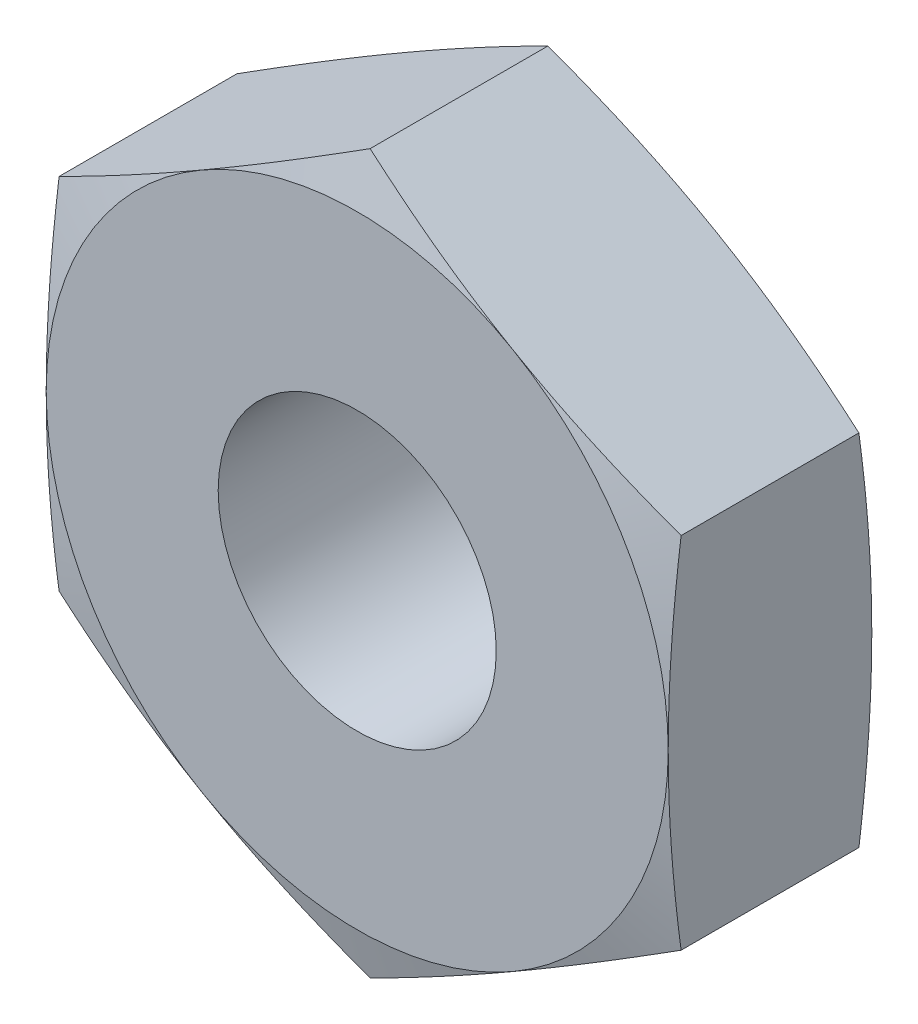
ISO-10303-21;
HEADER;
FILE_DESCRIPTION(('STEP AP214'),'2;1');
FILE_NAME('part.step','',(''),(''),'','','');
FILE_SCHEMA(('AUTOMOTIVE_DESIGN { 1 0 10303 214 1 1 1 1 }'));
ENDSEC;
DATA;
#1=APPLICATION_CONTEXT('core data for automotive mechanical design processes');
#2=APPLICATION_PROTOCOL_DEFINITION('international standard','automotive_design',2000,#1);
#3=PRODUCT_CONTEXT('',#1,'mechanical');
#4=PRODUCT('Part','Part','',(#3));
#5=PRODUCT_RELATED_PRODUCT_CATEGORY('part','',(#4));
#6=PRODUCT_DEFINITION_FORMATION('','',#4);
#7=PRODUCT_DEFINITION_CONTEXT('part definition',#1,'design');
#8=PRODUCT_DEFINITION('design','',#6,#7);
#9=PRODUCT_DEFINITION_SHAPE('','',#8);
#10=(LENGTH_UNIT() NAMED_UNIT(*) SI_UNIT(.MILLI.,.METRE.));
#11=(NAMED_UNIT(*) PLANE_ANGLE_UNIT() SI_UNIT($,.RADIAN.));
#12=(NAMED_UNIT(*) SI_UNIT($,.STERADIAN.) SOLID_ANGLE_UNIT());
#13=UNCERTAINTY_MEASURE_WITH_UNIT(LENGTH_MEASURE(1.E-05),#10,'distance_accuracy_value','');
#14=(GEOMETRIC_REPRESENTATION_CONTEXT(3) GLOBAL_UNCERTAINTY_ASSIGNED_CONTEXT((#13)) GLOBAL_UNIT_ASSIGNED_CONTEXT((#10,
#11,#12)) REPRESENTATION_CONTEXT('',''));
#15=CARTESIAN_POINT('',(0.,0.,0.));
#16=DIRECTION('',(0.,0.,1.));
#17=DIRECTION('',(1.,0.,0.));
#18=AXIS2_PLACEMENT_3D('',#15,#16,#17);
#19=CARTESIAN_POINT('',(2.75,1.58771324027147,1.8));
#20=DIRECTION('',(-0.5,-0.866025403784439,0.));
#21=DIRECTION('',(0.866025403784439,-0.5,0.));
#22=AXIS2_PLACEMENT_3D('',#19,#20,#21);
#23=PLANE('',#22);
#24=CARTESIAN_POINT('',(2.7502,1.58759777021763,1.68597637630445));
#25=CARTESIAN_POINT('',(2.63598285454709,1.65354106989094,1.70365443906504));
#26=CARTESIAN_POINT('',(2.52155860080835,1.71960394358883,1.71970328837943));
#27=CARTESIAN_POINT('',(2.29230593851367,1.8519630298771,1.74789971485019));
#28=CARTESIAN_POINT('',(2.17747738484796,1.91825932624665,1.7600457069014));
#29=CARTESIAN_POINT('',(1.94811243055202,2.05068324435208,1.7797272517536));
#30=CARTESIAN_POINT('',(1.83357758136237,2.11680997036331,1.78728627891702));
#31=CARTESIAN_POINT('',(1.60436179973292,2.24914776358959,1.79742217092489));
#32=CARTESIAN_POINT('',(1.48968089986646,2.3153588119984,1.8));
#33=CARTESIAN_POINT('',(1.26031910013354,2.44778090881602,1.8));
#34=CARTESIAN_POINT('',(1.14563820026708,2.51399195722482,1.79742217092489));
#35=CARTESIAN_POINT('',(0.91642241863763,2.6463297504511,1.78728627891702));
#36=CARTESIAN_POINT('',(0.801887569447985,2.71245647646233,1.7797272517536));
#37=CARTESIAN_POINT('',(0.572522615152036,2.84488039456776,1.7600457069014));
#38=CARTESIAN_POINT('',(0.457694061486332,2.91117669093731,1.74789971485019));
#39=CARTESIAN_POINT('',(0.228441399191655,3.04353577722558,1.71970328837943));
#40=CARTESIAN_POINT('',(0.114017145452912,3.10959865092347,1.70365443906504));
#41=CARTESIAN_POINT('',(-0.000199999999999591,3.17554195059678,1.68597637630445));
#42=B_SPLINE_CURVE_WITH_KNOTS('',3,(#24,#25,#26,#27,#28,#29,#30,#31,#32,#33,#34,#35,#36,#37,#38,
#39,#40,#41),.UNSPECIFIED.,.F.,.F.,(4,2,2,2,2,2,2,2,4),(0.,0.399219246203695,0.798600426844826,
1.19592009799431,1.59316285066086,1.99040560332741,2.38772527447689,2.78710645511802,
3.18632570132172),.UNSPECIFIED.);
#43=CARTESIAN_POINT('',(2.75,1.58771324027147,1.68600731809971));
#44=VERTEX_POINT('',#43);
#45=CARTESIAN_POINT('',(1.375,2.38156986040721,1.8));
#46=VERTEX_POINT('',#45);
#47=EDGE_CURVE('E130',#44,#46,#42,.T.);
#48=ORIENTED_EDGE('',*,*,#47,.F.);
#49=DIRECTION('',(0.,0.,-1.));
#50=VECTOR('',#49,1.);
#51=CARTESIAN_POINT('',(2.75,1.58771324027147,1.8));
#52=LINE('',#51,#50);
#53=CARTESIAN_POINT('',(2.75,1.58771324027147,0.113992681900295));
#54=VERTEX_POINT('',#53);
#55=EDGE_CURVE('E238',#44,#54,#52,.T.);
#56=ORIENTED_EDGE('',*,*,#55,.T.);
#57=CARTESIAN_POINT('',(-0.000200000000000002,3.17554195059678,0.114023623695551));
#58=CARTESIAN_POINT('',(0.114017145452911,3.10959865092347,0.0963455609349599));
#59=CARTESIAN_POINT('',(0.228441399191655,3.04353577722558,0.0802967116205655));
#60=CARTESIAN_POINT('',(0.457694061486332,2.91117669093731,0.0521002851498102));
#61=CARTESIAN_POINT('',(0.572522615152035,2.84488039456776,0.0399542930985983));
#62=CARTESIAN_POINT('',(0.801887569447984,2.71245647646233,0.0202727482464014));
#63=CARTESIAN_POINT('',(0.91642241863763,2.6463297504511,0.012713721082982));
#64=CARTESIAN_POINT('',(1.14563820026708,2.51399195722482,0.00257782907510846));
#65=CARTESIAN_POINT('',(1.26031910013354,2.44778090881602,0.));
#66=CARTESIAN_POINT('',(1.48968089986646,2.3153588119984,0.));
#67=CARTESIAN_POINT('',(1.60436179973292,2.24914776358959,0.00257782907510843));
#68=CARTESIAN_POINT('',(1.83357758136237,2.11680997036331,0.012713721082982));
#69=CARTESIAN_POINT('',(1.94811243055201,2.05068324435208,0.0202727482464014));
#70=CARTESIAN_POINT('',(2.17747738484796,1.91825932624665,0.0399542930985985));
#71=CARTESIAN_POINT('',(2.29230593851367,1.8519630298771,0.0521002851498105));
#72=CARTESIAN_POINT('',(2.52155860080835,1.71960394358883,0.0802967116205658));
#73=CARTESIAN_POINT('',(2.63598285454709,1.65354106989094,0.0963455609349602));
#74=CARTESIAN_POINT('',(2.7502,1.58759777021763,0.114023623695551));
#75=B_SPLINE_CURVE_WITH_KNOTS('',3,(#57,#58,#59,#60,#61,#62,#63,#64,#65,#66,#67,#68,#69,#70,#71,
#72,#73,#74),.UNSPECIFIED.,.F.,.F.,(4,2,2,2,2,2,2,2,4),(0.,0.399219246203695,0.798600426844827,
1.19592009799431,1.59316285066086,1.99040560332741,2.38772527447689,2.78710645511802,
3.18632570132172),.UNSPECIFIED.);
#76=CARTESIAN_POINT('',(1.375,2.38156986040721,0.));
#77=VERTEX_POINT('',#76);
#78=EDGE_CURVE('E278',#77,#54,#75,.T.);
#79=ORIENTED_EDGE('',*,*,#78,.F.);
#80=CARTESIAN_POINT('',(0.,3.17542648054294,0.113992681900294));
#81=VERTEX_POINT('',#80);
#82=EDGE_CURVE('E284',#81,#77,#75,.T.);
#83=ORIENTED_EDGE('',*,*,#82,.F.);
#84=DIRECTION('',(0.,0.,-1.));
#85=VECTOR('',#84,1.);
#86=CARTESIAN_POINT('',(0.,3.17542648054294,1.8));
#87=LINE('',#86,#85);
#88=CARTESIAN_POINT('',(0.,3.17542648054294,1.68600731809971));
#89=VERTEX_POINT('',#88);
#90=EDGE_CURVE('E153',#89,#81,#87,.T.);
#91=ORIENTED_EDGE('',*,*,#90,.F.);
#92=EDGE_CURVE('E140',#46,#89,#42,.T.);
#93=ORIENTED_EDGE('',*,*,#92,.F.);
#94=EDGE_LOOP('',(#48,#56,#79,#83,#91,#93));
#95=FACE_BOUND('',#94,.T.);
#96=ADVANCED_FACE('F38',(#95),#23,.F.);
#97=CARTESIAN_POINT('',(0.,3.17542648054294,1.8));
#98=DIRECTION('',(0.5,-0.866025403784439,0.));
#99=DIRECTION('',(0.866025403784439,0.5,0.));
#100=AXIS2_PLACEMENT_3D('',#97,#98,#99);
#101=PLANE('',#100);
#102=CARTESIAN_POINT('',(0.000200000000000058,3.17554195059678,1.68597637630445));
#103=CARTESIAN_POINT('',(-0.114017145452912,3.10959865092347,1.70365443906504));
#104=CARTESIAN_POINT('',(-0.228441399191655,3.04353577722558,1.71970328837943));
#105=CARTESIAN_POINT('',(-0.457694061486332,2.91117669093731,1.74789971485019));
#106=CARTESIAN_POINT('',(-0.572522615152036,2.84488039456776,1.7600457069014));
#107=CARTESIAN_POINT('',(-0.801887569447985,2.71245647646233,1.7797272517536));
#108=CARTESIAN_POINT('',(-0.916422418637631,2.6463297504511,1.78728627891702));
#109=CARTESIAN_POINT('',(-1.14563820026708,2.51399195722482,1.79742217092489));
#110=CARTESIAN_POINT('',(-1.26031910013354,2.44778090881602,1.8));
#111=CARTESIAN_POINT('',(-1.48968089986646,2.3153588119984,1.8));
#112=CARTESIAN_POINT('',(-1.60436179973292,2.24914776358959,1.79742217092489));
#113=CARTESIAN_POINT('',(-1.83357758136237,2.11680997036331,1.78728627891702));
#114=CARTESIAN_POINT('',(-1.94811243055202,2.05068324435208,1.7797272517536));
#115=CARTESIAN_POINT('',(-2.17747738484796,1.91825932624665,1.7600457069014));
#116=CARTESIAN_POINT('',(-2.29230593851367,1.8519630298771,1.74789971485019));
#117=CARTESIAN_POINT('',(-2.52155860080835,1.71960394358883,1.71970328837943));
#118=CARTESIAN_POINT('',(-2.63598285454709,1.65354106989094,1.70365443906504));
#119=CARTESIAN_POINT('',(-2.7502,1.58759777021763,1.68597637630445));
#120=B_SPLINE_CURVE_WITH_KNOTS('',3,(#102,#103,#104,#105,#106,#107,#108,#109,#110,#111,#112,
#113,#114,#115,#116,#117,#118,#119),.UNSPECIFIED.,.F.,.F.,(4,2,2,2,2,2,2,2,4),(0.,
0.399219246203696,0.798600426844827,1.19592009799431,1.59316285066086,1.99040560332741,
2.38772527447689,2.78710645511802,3.18632570132172),.UNSPECIFIED.);
#121=CARTESIAN_POINT('',(-1.375,2.38156986040721,1.8));
#122=VERTEX_POINT('',#121);
#123=EDGE_CURVE('E145',#89,#122,#120,.T.);
#124=ORIENTED_EDGE('',*,*,#123,.F.);
#125=ORIENTED_EDGE('',*,*,#90,.T.);
#126=CARTESIAN_POINT('',(-2.7502,1.58759777021763,0.114023623695551));
#127=CARTESIAN_POINT('',(-2.63598285454709,1.65354106989094,0.0963455609349604));
#128=CARTESIAN_POINT('',(-2.52155860080835,1.71960394358883,0.0802967116205659));
#129=CARTESIAN_POINT('',(-2.29230593851367,1.8519630298771,0.0521002851498105));
#130=CARTESIAN_POINT('',(-2.17747738484796,1.91825932624665,0.0399542930985984));
#131=CARTESIAN_POINT('',(-1.94811243055202,2.05068324435208,0.0202727482464014));
#132=CARTESIAN_POINT('',(-1.83357758136237,2.11680997036331,0.0127137210829821));
#133=CARTESIAN_POINT('',(-1.60436179973292,2.24914776358959,0.00257782907510853));
#134=CARTESIAN_POINT('',(-1.48968089986646,2.3153588119984,0.));
#135=CARTESIAN_POINT('',(-1.26031910013354,2.44778090881602,0.));
#136=CARTESIAN_POINT('',(-1.14563820026708,2.51399195722482,0.00257782907510842));
#137=CARTESIAN_POINT('',(-0.916422418637631,2.6463297504511,0.0127137210829819));
#138=CARTESIAN_POINT('',(-0.801887569447985,2.71245647646233,0.0202727482464013));
#139=CARTESIAN_POINT('',(-0.572522615152036,2.84488039456776,0.0399542930985984));
#140=CARTESIAN_POINT('',(-0.457694061486332,2.91117669093731,0.0521002851498103));
#141=CARTESIAN_POINT('',(-0.228441399191655,3.04353577722558,0.0802967116205656));
#142=CARTESIAN_POINT('',(-0.114017145452912,3.10959865092347,0.09634556093496));
#143=CARTESIAN_POINT('',(0.00020000000000006,3.17554195059678,0.114023623695551));
#144=B_SPLINE_CURVE_WITH_KNOTS('',3,(#126,#127,#128,#129,#130,#131,#132,#133,#134,#135,#136,
#137,#138,#139,#140,#141,#142,#143),.UNSPECIFIED.,.F.,.F.,(4,2,2,2,2,2,2,2,4),(0.,
0.399219246203695,0.798600426844827,1.19592009799431,1.59316285066086,1.99040560332741,
2.38772527447689,2.78710645511802,3.18632570132172),.UNSPECIFIED.);
#145=CARTESIAN_POINT('',(-1.375,2.38156986040721,0.));
#146=VERTEX_POINT('',#145);
#147=EDGE_CURVE('E229',#146,#81,#144,.T.);
#148=ORIENTED_EDGE('',*,*,#147,.F.);
#149=CARTESIAN_POINT('',(-2.75,1.58771324027147,0.113992681900295));
#150=VERTEX_POINT('',#149);
#151=EDGE_CURVE('E297',#150,#146,#144,.T.);
#152=ORIENTED_EDGE('',*,*,#151,.F.);
#153=DIRECTION('',(0.,0.,-1.));
#154=VECTOR('',#153,1.);
#155=CARTESIAN_POINT('',(-2.75,1.58771324027147,1.8));
#156=LINE('',#155,#154);
#157=CARTESIAN_POINT('',(-2.75,1.58771324027147,1.68600731809971));
#158=VERTEX_POINT('',#157);
#159=EDGE_CURVE('E249',#158,#150,#156,.T.);
#160=ORIENTED_EDGE('',*,*,#159,.F.);
#161=EDGE_CURVE('E154',#122,#158,#120,.T.);
#162=ORIENTED_EDGE('',*,*,#161,.F.);
#163=EDGE_LOOP('',(#124,#125,#148,#152,#160,#162));
#164=FACE_BOUND('',#163,.T.);
#165=ADVANCED_FACE('F213',(#164),#101,.F.);
#166=CARTESIAN_POINT('',(-2.75,1.58771324027147,1.8));
#167=DIRECTION('',(1.,0.,0.));
#168=DIRECTION('',(0.,1.,0.));
#169=AXIS2_PLACEMENT_3D('',#166,#167,#168);
#170=PLANE('',#169);
#171=CARTESIAN_POINT('',(-2.75,-4.25453687273644,1.17945008662811));
#172=CARTESIAN_POINT('',(-2.75,-4.12909089129006,1.20767247329542));
#173=CARTESIAN_POINT('',(-2.75,-4.00356795369818,1.23555805706843));
#174=CARTESIAN_POINT('',(-2.75,-3.75233011444115,1.29047493653844));
#175=CARTESIAN_POINT('',(-2.75,-3.626615205051,1.31750619685393));
#176=CARTESIAN_POINT('',(-2.75,-3.37485312154851,1.370555112766));
#177=CARTESIAN_POINT('',(-2.75,-3.24880575075381,1.39657183947184));
#178=CARTESIAN_POINT('',(-2.75,-2.99645280115617,1.44731465391408));
#179=CARTESIAN_POINT('',(-2.75,-2.87014722444224,1.47204075204958));
#180=CARTESIAN_POINT('',(-2.75,-2.49300467644484,1.54342857241483));
#181=CARTESIAN_POINT('',(-2.75,-2.24172159436404,1.58777757678498));
#182=CARTESIAN_POINT('',(-2.75,-1.7376157375192,1.66694239256266));
#183=CARTESIAN_POINT('',(-2.75,-1.48479314049277,1.70175928389781));
#184=CARTESIAN_POINT('',(-2.75,-1.10290958741393,1.74356563703142));
#185=CARTESIAN_POINT('',(-2.75,-0.974426083027352,1.7558043409763));
#186=CARTESIAN_POINT('',(-2.75,-0.717131491270936,1.77607018305311));
#187=CARTESIAN_POINT('',(-2.75,-0.588320433054099,1.78409768365752));
#188=CARTESIAN_POINT('',(-2.75,-0.330552993362774,1.79547685370073));
#189=CARTESIAN_POINT('',(-2.75,-0.201596717702777,1.7988308751996));
#190=CARTESIAN_POINT('',(-2.75,0.0563509023935529,1.80065532808311));
#191=CARTESIAN_POINT('',(-2.75,0.185342246751155,1.79912577034246));
#192=CARTESIAN_POINT('',(-2.75,0.443745656700354,1.79126544452901));
#193=CARTESIAN_POINT('',(-2.75,0.573157064948089,1.78491350559601));
#194=CARTESIAN_POINT('',(-2.75,0.831686842018706,1.76777141461889));
#195=CARTESIAN_POINT('',(-2.75,0.96080519485833,1.75698102608503));
#196=CARTESIAN_POINT('',(-2.75,1.21874620164664,1.73152067195787));
#197=CARTESIAN_POINT('',(-2.75,1.34756857747991,1.71684793249756));
#198=CARTESIAN_POINT('',(-2.75,1.60479542826123,1.68425029283339));
#199=CARTESIAN_POINT('',(-2.75,1.7331999043507,1.66632540151996));
#200=CARTESIAN_POINT('',(-2.75,2.01078933211007,1.62463385061709));
#201=CARTESIAN_POINT('',(-2.75,2.15990224778535,1.60039132237994));
#202=CARTESIAN_POINT('',(-2.75,2.45764548681983,1.5490930629821));
#203=CARTESIAN_POINT('',(-2.75,2.60627578642122,1.52203719543054));
#204=CARTESIAN_POINT('',(-2.75,2.90314719325471,1.46574163878066));
#205=CARTESIAN_POINT('',(-2.75,3.05138822629453,1.43650156080234));
#206=CARTESIAN_POINT('',(-2.75,3.34752619803917,1.37632306581721));
#207=CARTESIAN_POINT('',(-2.75,3.49542313032354,1.34538461738191));
#208=CARTESIAN_POINT('',(-2.75,3.93882414451981,1.2505685954105));
#209=CARTESIAN_POINT('',(-2.75,4.23390501652389,1.18471640243034));
#210=CARTESIAN_POINT('',(-2.75,4.82331106256456,1.0497140323235));
#211=CARTESIAN_POINT('',(-2.75,5.11763621517978,0.980563762774737));
#212=CARTESIAN_POINT('',(-2.75,5.7015455399541,0.841080402530205));
#213=CARTESIAN_POINT('',(-2.75,5.99113717763739,0.770778490171721));
#214=CARTESIAN_POINT('',(-2.75,6.56996820229718,0.628701349925971));
#215=CARTESIAN_POINT('',(-2.75,6.85920757686581,0.556926071646078));
#216=CARTESIAN_POINT('',(-2.75,7.43690019898123,0.412457441864233));
#217=CARTESIAN_POINT('',(-2.75,7.72535392177245,0.339765987526337));
#218=CARTESIAN_POINT('',(-2.75,8.3020483493631,0.193598211670681));
#219=CARTESIAN_POINT('',(-2.75,8.59028906340869,0.120121926655646));
#220=CARTESIAN_POINT('',(-2.75,8.87846102559692,0.0463799887537183));
#221=B_SPLINE_CURVE_WITH_KNOTS('',3,(#171,#172,#173,#174,#175,#176,#177,#178,#179,#180,#181,
#182,#183,#184,#185,#186,#187,#188,#189,#190,#191,#192,#193,#194,#195,#196,#197,#198,#199,#200,
#201,#202,#203,#204,#205,#206,#207,#208,#209,#210,#211,#212,#213,#214,#215,#216,#217,#218,#219,
#220),.UNSPECIFIED.,.F.,.F.,(4,2,2,2,2,2,2,2,2,2,2,2,2,2,2,2,2,2,2,2,2,2,2,2,4),(0.,
0.385745633364974,0.771507221376578,1.15761408845767,1.54371784404495,2.30911364653726,
3.07442269864926,3.46156048964449,3.84866495291471,4.23557452450059,4.6224832345202,
5.01110041568801,5.39973830586289,5.7886546238612,6.17756987869289,6.63074612953532,
7.08394436064651,7.53722347303431,7.99051097621848,8.89749375633669,9.80450196780339,
10.6985045624971,11.5925377853268,12.4849525738477,13.3773260350548),.UNSPECIFIED.);
#222=CARTESIAN_POINT('',(-2.75,0.,1.8));
#223=VERTEX_POINT('',#222);
#224=EDGE_CURVE('E207',#158,#223,#221,.F.);
#225=ORIENTED_EDGE('',*,*,#224,.F.);
#226=ORIENTED_EDGE('',*,*,#159,.T.);
#227=CARTESIAN_POINT('',(-2.75,-4.25453687273644,0.62054991337189));
#228=CARTESIAN_POINT('',(-2.75,-4.12909089129006,0.592327526704578));
#229=CARTESIAN_POINT('',(-2.75,-4.00356795369818,0.564441942931572));
#230=CARTESIAN_POINT('',(-2.75,-3.75233011444115,0.509525063461557));
#231=CARTESIAN_POINT('',(-2.75,-3.626615205051,0.482493803146066));
#232=CARTESIAN_POINT('',(-2.75,-3.37485312154851,0.429444887233998));
#233=CARTESIAN_POINT('',(-2.75,-3.24880575075381,0.403428160528158));
#234=CARTESIAN_POINT('',(-2.75,-2.99645280115617,0.352685346085919));
#235=CARTESIAN_POINT('',(-2.75,-2.87014722444224,0.327959247950424));
#236=CARTESIAN_POINT('',(-2.75,-2.49300467644484,0.25657142758517));
#237=CARTESIAN_POINT('',(-2.75,-2.24172159436404,0.212222423215025));
#238=CARTESIAN_POINT('',(-2.75,-1.7376157375192,0.133057607437342));
#239=CARTESIAN_POINT('',(-2.75,-1.48479314049277,0.098240716102193));
#240=CARTESIAN_POINT('',(-2.75,-1.10290958741393,0.0564343629685761));
#241=CARTESIAN_POINT('',(-2.75,-0.974426083027352,0.0441956590237022));
#242=CARTESIAN_POINT('',(-2.75,-0.717131491270936,0.0239298169468935));
#243=CARTESIAN_POINT('',(-2.75,-0.588320433054099,0.0159023163424837));
#244=CARTESIAN_POINT('',(-2.75,-0.330552993362774,0.00452314629927444));
#245=CARTESIAN_POINT('',(-2.75,-0.201596717702777,0.00116912480040349));
#246=CARTESIAN_POINT('',(-2.75,0.0563509023935528,-0.000655328083106099));
#247=CARTESIAN_POINT('',(-2.75,0.185342246751155,0.000874229657543568));
#248=CARTESIAN_POINT('',(-2.75,0.443745656700355,0.00873455547099419));
#249=CARTESIAN_POINT('',(-2.75,0.573157064948089,0.0150864944039938));
#250=CARTESIAN_POINT('',(-2.75,0.831686842018706,0.0322285853811115));
#251=CARTESIAN_POINT('',(-2.75,0.96080519485833,0.0430189739149718));
#252=CARTESIAN_POINT('',(-2.75,1.21874620164664,0.0684793280421257));
#253=CARTESIAN_POINT('',(-2.75,1.34756857747991,0.0831520675024364));
#254=CARTESIAN_POINT('',(-2.75,1.60479542826123,0.115749707166606));
#255=CARTESIAN_POINT('',(-2.75,1.7331999043507,0.133674598480039));
#256=CARTESIAN_POINT('',(-2.75,2.01078933211007,0.175366149382907));
#257=CARTESIAN_POINT('',(-2.75,2.15990224778535,0.199608677620064));
#258=CARTESIAN_POINT('',(-2.75,2.45764548681983,0.250906937017898));
#259=CARTESIAN_POINT('',(-2.75,2.60627578642122,0.277962804569464));
#260=CARTESIAN_POINT('',(-2.75,2.90314719325471,0.334258361219342));
#261=CARTESIAN_POINT('',(-2.75,3.05138822629453,0.36349843919766));
#262=CARTESIAN_POINT('',(-2.75,3.34752619803917,0.423676934182794));
#263=CARTESIAN_POINT('',(-2.75,3.49542313032354,0.454615382618093));
#264=CARTESIAN_POINT('',(-2.75,3.93882414451981,0.549431404589501));
#265=CARTESIAN_POINT('',(-2.75,4.23390501652388,0.615283597569656));
#266=CARTESIAN_POINT('',(-2.75,4.82331106256456,0.750285967676502));
#267=CARTESIAN_POINT('',(-2.75,5.11763621517977,0.819436237225262));
#268=CARTESIAN_POINT('',(-2.75,5.70154553995409,0.958919597469795));
#269=CARTESIAN_POINT('',(-2.75,5.99113717763739,1.02922150982828));
#270=CARTESIAN_POINT('',(-2.75,6.56996820229717,1.17129865007403));
#271=CARTESIAN_POINT('',(-2.75,6.85920757686581,1.24307392835392));
#272=CARTESIAN_POINT('',(-2.75,7.43690019898123,1.38754255813577));
#273=CARTESIAN_POINT('',(-2.75,7.72535392177245,1.46023401247366));
#274=CARTESIAN_POINT('',(-2.75,8.3020483493631,1.60640178832932));
#275=CARTESIAN_POINT('',(-2.75,8.59028906340868,1.67987807334435));
#276=CARTESIAN_POINT('',(-2.75,8.87846102559692,1.75362001124628));
#277=B_SPLINE_CURVE_WITH_KNOTS('',3,(#227,#228,#229,#230,#231,#232,#233,#234,#235,#236,#237,
#238,#239,#240,#241,#242,#243,#244,#245,#246,#247,#248,#249,#250,#251,#252,#253,#254,#255,#256,
#257,#258,#259,#260,#261,#262,#263,#264,#265,#266,#267,#268,#269,#270,#271,#272,#273,#274,#275,
#276),.UNSPECIFIED.,.F.,.F.,(4,2,2,2,2,2,2,2,2,2,2,2,2,2,2,2,2,2,2,2,2,2,2,2,4),(0.,
0.385745633364974,0.771507221376578,1.15761408845767,1.54371784404495,2.30911364653726,
3.07442269864926,3.46156048964449,3.84866495291471,4.23557452450059,4.6224832345202,
5.01110041568801,5.39973830586289,5.7886546238612,6.17756987869289,6.63074612953533,
7.08394436064651,7.53722347303431,7.99051097621848,8.89749375633669,9.80450196780339,
10.6985045624971,11.5925377853268,12.4849525738477,13.3773260350548),.UNSPECIFIED.);
#278=CARTESIAN_POINT('',(-2.75,0.,0.));
#279=VERTEX_POINT('',#278);
#280=EDGE_CURVE('E219',#279,#150,#277,.T.);
#281=ORIENTED_EDGE('',*,*,#280,.F.);
#282=CARTESIAN_POINT('',(-2.75,-1.58771324027147,0.113992681900295));
#283=VERTEX_POINT('',#282);
#284=EDGE_CURVE('E227',#283,#279,#277,.T.);
#285=ORIENTED_EDGE('',*,*,#284,.F.);
#286=DIRECTION('',(0.,0.,-1.));
#287=VECTOR('',#286,1.);
#288=CARTESIAN_POINT('',(-2.75,-1.58771324027147,1.8));
#289=LINE('',#288,#287);
#290=CARTESIAN_POINT('',(-2.75,-1.58771324027147,1.68600731809971));
#291=VERTEX_POINT('',#290);
#292=EDGE_CURVE('E247',#291,#283,#289,.T.);
#293=ORIENTED_EDGE('',*,*,#292,.F.);
#294=EDGE_CURVE('E201',#223,#291,#221,.F.);
#295=ORIENTED_EDGE('',*,*,#294,.F.);
#296=EDGE_LOOP('',(#225,#226,#281,#285,#293,#295));
#297=FACE_BOUND('',#296,.T.);
#298=ADVANCED_FACE('F209',(#297),#170,.F.);
#299=CARTESIAN_POINT('',(-2.75,-1.58771324027147,1.8));
#300=DIRECTION('',(0.5,0.866025403784439,0.));
#301=DIRECTION('',(-0.866025403784439,0.5,0.));
#302=AXIS2_PLACEMENT_3D('',#299,#300,#301);
#303=PLANE('',#302);
#304=CARTESIAN_POINT('',(-2.7502,-1.58759777021763,1.68597637630445));
#305=CARTESIAN_POINT('',(-2.63598285454709,-1.65354106989094,1.70365443906504));
#306=CARTESIAN_POINT('',(-2.52155860080835,-1.71960394358883,1.71970328837943));
#307=CARTESIAN_POINT('',(-2.29230593851367,-1.8519630298771,1.74789971485019));
#308=CARTESIAN_POINT('',(-2.17747738484796,-1.91825932624665,1.7600457069014));
#309=CARTESIAN_POINT('',(-1.94811243055202,-2.05068324435208,1.7797272517536));
#310=CARTESIAN_POINT('',(-1.83357758136237,-2.11680997036332,1.78728627891702));
#311=CARTESIAN_POINT('',(-1.60436179973292,-2.24914776358959,1.79742217092489));
#312=CARTESIAN_POINT('',(-1.48968089986646,-2.3153588119984,1.8));
#313=CARTESIAN_POINT('',(-1.26031910013354,-2.44778090881602,1.8));
#314=CARTESIAN_POINT('',(-1.14563820026708,-2.51399195722482,1.79742217092489));
#315=CARTESIAN_POINT('',(-0.91642241863763,-2.6463297504511,1.78728627891702));
#316=CARTESIAN_POINT('',(-0.801887569447984,-2.71245647646233,1.7797272517536));
#317=CARTESIAN_POINT('',(-0.572522615152035,-2.84488039456777,1.7600457069014));
#318=CARTESIAN_POINT('',(-0.457694061486332,-2.91117669093731,1.74789971485019));
#319=CARTESIAN_POINT('',(-0.228441399191654,-3.04353577722559,1.71970328837943));
#320=CARTESIAN_POINT('',(-0.114017145452911,-3.10959865092347,1.70365443906504));
#321=CARTESIAN_POINT('',(0.000200000000000669,-3.17554195059678,1.68597637630445));
#322=B_SPLINE_CURVE_WITH_KNOTS('',3,(#304,#305,#306,#307,#308,#309,#310,#311,#312,#313,#314,
#315,#316,#317,#318,#319,#320,#321),.UNSPECIFIED.,.F.,.F.,(4,2,2,2,2,2,2,2,4),(0.,
0.399219246203695,0.798600426844826,1.19592009799431,1.59316285066086,1.99040560332741,
2.38772527447689,2.78710645511802,3.18632570132172),.UNSPECIFIED.);
#323=CARTESIAN_POINT('',(-1.375,-2.38156986040721,1.8));
#324=VERTEX_POINT('',#323);
#325=EDGE_CURVE('E208',#291,#324,#322,.T.);
#326=ORIENTED_EDGE('',*,*,#325,.F.);
#327=ORIENTED_EDGE('',*,*,#292,.T.);
#328=CARTESIAN_POINT('',(0.000200000000000461,-3.17554195059678,0.114023623695551));
#329=CARTESIAN_POINT('',(-0.114017145452911,-3.10959865092347,0.0963455609349601));
#330=CARTESIAN_POINT('',(-0.228441399191654,-3.04353577722559,0.0802967116205657));
#331=CARTESIAN_POINT('',(-0.457694061486332,-2.91117669093731,0.0521002851498103));
#332=CARTESIAN_POINT('',(-0.572522615152035,-2.84488039456777,0.0399542930985984));
#333=CARTESIAN_POINT('',(-0.801887569447984,-2.71245647646233,0.0202727482464014));
#334=CARTESIAN_POINT('',(-0.91642241863763,-2.6463297504511,0.0127137210829821));
#335=CARTESIAN_POINT('',(-1.14563820026708,-2.51399195722482,0.00257782907510852));
#336=CARTESIAN_POINT('',(-1.26031910013354,-2.44778090881602,0.));
#337=CARTESIAN_POINT('',(-1.48968089986646,-2.3153588119984,0.));
#338=CARTESIAN_POINT('',(-1.60436179973292,-2.24914776358959,0.00257782907510852));
#339=CARTESIAN_POINT('',(-1.83357758136237,-2.11680997036332,0.0127137210829821));
#340=CARTESIAN_POINT('',(-1.94811243055202,-2.05068324435208,0.0202727482464014));
#341=CARTESIAN_POINT('',(-2.17747738484796,-1.91825932624665,0.0399542930985985));
#342=CARTESIAN_POINT('',(-2.29230593851367,-1.8519630298771,0.0521002851498105));
#343=CARTESIAN_POINT('',(-2.52155860080835,-1.71960394358883,0.080296711620566));
#344=CARTESIAN_POINT('',(-2.63598285454709,-1.65354106989094,0.0963455609349605));
#345=CARTESIAN_POINT('',(-2.7502,-1.58759777021763,0.114023623695552));
#346=B_SPLINE_CURVE_WITH_KNOTS('',3,(#328,#329,#330,#331,#332,#333,#334,#335,#336,#337,#338,
#339,#340,#341,#342,#343,#344,#345),.UNSPECIFIED.,.F.,.F.,(4,2,2,2,2,2,2,2,4),(0.,
0.399219246203696,0.798600426844827,1.19592009799431,1.59316285066086,1.99040560332741,
2.38772527447689,2.78710645511802,3.18632570132172),.UNSPECIFIED.);
#347=CARTESIAN_POINT('',(-1.375,-2.38156986040721,0.));
#348=VERTEX_POINT('',#347);
#349=EDGE_CURVE('E228',#348,#283,#346,.T.);
#350=ORIENTED_EDGE('',*,*,#349,.F.);
#351=CARTESIAN_POINT('',(0.,-3.17542648054294,0.113992681900295));
#352=VERTEX_POINT('',#351);
#353=EDGE_CURVE('E285',#352,#348,#346,.T.);
#354=ORIENTED_EDGE('',*,*,#353,.F.);
#355=DIRECTION('',(0.,0.,-1.));
#356=VECTOR('',#355,1.);
#357=CARTESIAN_POINT('',(0.,-3.17542648054294,1.8));
#358=LINE('',#357,#356);
#359=CARTESIAN_POINT('',(0.,-3.17542648054294,1.68600731809971));
#360=VERTEX_POINT('',#359);
#361=EDGE_CURVE('E245',#360,#352,#358,.T.);
#362=ORIENTED_EDGE('',*,*,#361,.F.);
#363=EDGE_CURVE('E195',#324,#360,#322,.T.);
#364=ORIENTED_EDGE('',*,*,#363,.F.);
#365=EDGE_LOOP('',(#326,#327,#350,#354,#362,#364));
#366=FACE_BOUND('',#365,.T.);
#367=ADVANCED_FACE('F212',(#366),#303,.F.);
#368=CARTESIAN_POINT('',(0.,-3.17542648054294,1.8));
#369=DIRECTION('',(-0.5,0.866025403784439,0.));
#370=DIRECTION('',(-0.866025403784439,-0.5,0.));
#371=AXIS2_PLACEMENT_3D('',#368,#369,#370);
#372=PLANE('',#371);
#373=CARTESIAN_POINT('',(-0.000199999999999584,-3.17554195059678,1.68597637630445));
#374=CARTESIAN_POINT('',(0.114017145452912,-3.10959865092347,1.70365443906504));
#375=CARTESIAN_POINT('',(0.228441399191655,-3.04353577722559,1.71970328837943));
#376=CARTESIAN_POINT('',(0.457694061486332,-2.91117669093731,1.74789971485019));
#377=CARTESIAN_POINT('',(0.572522615152036,-2.84488039456777,1.7600457069014));
#378=CARTESIAN_POINT('',(0.801887569447985,-2.71245647646233,1.7797272517536));
#379=CARTESIAN_POINT('',(0.916422418637631,-2.6463297504511,1.78728627891702));
#380=CARTESIAN_POINT('',(1.14563820026708,-2.51399195722482,1.79742217092489));
#381=CARTESIAN_POINT('',(1.26031910013354,-2.44778090881602,1.8));
#382=CARTESIAN_POINT('',(1.48968089986646,-2.3153588119984,1.8));
#383=CARTESIAN_POINT('',(1.60436179973292,-2.24914776358959,1.79742217092489));
#384=CARTESIAN_POINT('',(1.83357758136237,-2.11680997036332,1.78728627891702));
#385=CARTESIAN_POINT('',(1.94811243055202,-2.05068324435208,1.7797272517536));
#386=CARTESIAN_POINT('',(2.17747738484796,-1.91825932624665,1.7600457069014));
#387=CARTESIAN_POINT('',(2.29230593851367,-1.8519630298771,1.74789971485019));
#388=CARTESIAN_POINT('',(2.52155860080835,-1.71960394358883,1.71970328837943));
#389=CARTESIAN_POINT('',(2.63598285454709,-1.65354106989094,1.70365443906504));
#390=CARTESIAN_POINT('',(2.7502,-1.58759777021763,1.68597637630445));
#391=B_SPLINE_CURVE_WITH_KNOTS('',3,(#373,#374,#375,#376,#377,#378,#379,#380,#381,#382,#383,
#384,#385,#386,#387,#388,#389,#390),.UNSPECIFIED.,.F.,.F.,(4,2,2,2,2,2,2,2,4),(0.,
0.399219246203695,0.798600426844827,1.19592009799431,1.59316285066086,1.99040560332741,
2.38772527447689,2.78710645511802,3.18632570132172),.UNSPECIFIED.);
#392=CARTESIAN_POINT('',(1.375,-2.38156986040721,1.8));
#393=VERTEX_POINT('',#392);
#394=EDGE_CURVE('E484',#360,#393,#391,.T.);
#395=ORIENTED_EDGE('',*,*,#394,.F.);
#396=ORIENTED_EDGE('',*,*,#361,.T.);
#397=CARTESIAN_POINT('',(2.7502,-1.58759777021763,0.114023623695552));
#398=CARTESIAN_POINT('',(2.63598285454709,-1.65354106989094,0.0963455609349605));
#399=CARTESIAN_POINT('',(2.52155860080835,-1.71960394358883,0.080296711620566));
#400=CARTESIAN_POINT('',(2.29230593851367,-1.8519630298771,0.0521002851498106));
#401=CARTESIAN_POINT('',(2.17747738484797,-1.91825932624665,0.0399542930985987));
#402=CARTESIAN_POINT('',(1.94811243055202,-2.05068324435208,0.0202727482464017));
#403=CARTESIAN_POINT('',(1.83357758136237,-2.11680997036331,0.0127137210829822));
#404=CARTESIAN_POINT('',(1.60436179973292,-2.24914776358959,0.00257782907510859));
#405=CARTESIAN_POINT('',(1.48968089986646,-2.3153588119984,0.));
#406=CARTESIAN_POINT('',(1.26031910013354,-2.44778090881602,0.));
#407=CARTESIAN_POINT('',(1.14563820026708,-2.51399195722482,0.00257782907510851));
#408=CARTESIAN_POINT('',(0.916422418637631,-2.6463297504511,0.012713721082982));
#409=CARTESIAN_POINT('',(0.801887569447985,-2.71245647646233,0.0202727482464013));
#410=CARTESIAN_POINT('',(0.572522615152036,-2.84488039456777,0.0399542930985983));
#411=CARTESIAN_POINT('',(0.457694061486333,-2.91117669093731,0.0521002851498102));
#412=CARTESIAN_POINT('',(0.228441399191655,-3.04353577722558,0.0802967116205656));
#413=CARTESIAN_POINT('',(0.114017145452912,-3.10959865092347,0.0963455609349601));
#414=CARTESIAN_POINT('',(-0.000199999999999377,-3.17554195059678,0.114023623695551));
#415=B_SPLINE_CURVE_WITH_KNOTS('',3,(#397,#398,#399,#400,#401,#402,#403,#404,#405,#406,#407,
#408,#409,#410,#411,#412,#413,#414),.UNSPECIFIED.,.F.,.F.,(4,2,2,2,2,2,2,2,4),(0.,
0.399219246203696,0.798600426844826,1.19592009799431,1.59316285066086,1.99040560332741,
2.38772527447689,2.78710645511802,3.18632570132172),.UNSPECIFIED.);
#416=CARTESIAN_POINT('',(1.375,-2.38156986040721,0.));
#417=VERTEX_POINT('',#416);
#418=EDGE_CURVE('E279',#417,#352,#415,.T.);
#419=ORIENTED_EDGE('',*,*,#418,.F.);
#420=CARTESIAN_POINT('',(2.75,-1.58771324027147,0.113992681900294));
#421=VERTEX_POINT('',#420);
#422=EDGE_CURVE('E271',#421,#417,#415,.T.);
#423=ORIENTED_EDGE('',*,*,#422,.F.);
#424=DIRECTION('',(0.,0.,-1.));
#425=VECTOR('',#424,1.);
#426=CARTESIAN_POINT('',(2.75,-1.58771324027147,1.8));
#427=LINE('',#426,#425);
#428=CARTESIAN_POINT('',(2.75,-1.58771324027147,1.68600731809971));
#429=VERTEX_POINT('',#428);
#430=EDGE_CURVE('E243',#429,#421,#427,.T.);
#431=ORIENTED_EDGE('',*,*,#430,.F.);
#432=EDGE_CURVE('E188',#393,#429,#391,.T.);
#433=ORIENTED_EDGE('',*,*,#432,.F.);
#434=EDGE_LOOP('',(#395,#396,#419,#423,#431,#433));
#435=FACE_BOUND('',#434,.T.);
#436=ADVANCED_FACE('F262',(#435),#372,.F.);
#437=CARTESIAN_POINT('',(2.75,-1.58771324027147,1.8));
#438=DIRECTION('',(-1.,0.,0.));
#439=DIRECTION('',(0.,-1.,0.));
#440=AXIS2_PLACEMENT_3D('',#437,#438,#439);
#441=PLANE('',#440);
#442=CARTESIAN_POINT('',(2.75,-4.254536873186,1.17945008652694));
#443=CARTESIAN_POINT('',(2.75,-4.12909089172142,1.20767247319923));
#444=CARTESIAN_POINT('',(2.75,-4.00356795411133,1.23555805697719));
#445=CARTESIAN_POINT('',(2.75,-3.75233011481787,1.29047493645704));
#446=CARTESIAN_POINT('',(2.75,-3.62661520540949,1.31750619677741));
#447=CARTESIAN_POINT('',(2.75,-3.37485312187046,1.37055511269915));
#448=CARTESIAN_POINT('',(2.75,-3.24880575105744,1.39657183940977));
#449=CARTESIAN_POINT('',(2.75,-2.99645280142313,1.44731465386141));
#450=CARTESIAN_POINT('',(2.75,-2.87014722469083,1.47204075200152));
#451=CARTESIAN_POINT('',(2.75,-2.49300467663928,1.54342857238003));
#452=CARTESIAN_POINT('',(2.75,-2.2417215945226,1.58777757675847));
#453=CARTESIAN_POINT('',(2.75,-1.73761573760561,1.66694239255068));
#454=CARTESIAN_POINT('',(2.75,-1.4847931405429,1.70175928389207));
#455=CARTESIAN_POINT('',(2.75,-1.10290958740735,1.74356563703227));
#456=CARTESIAN_POINT('',(2.75,-0.974426083000506,1.75580434097893));
#457=CARTESIAN_POINT('',(2.75,-0.717131491203464,1.7760701830579));
#458=CARTESIAN_POINT('',(2.75,-0.588320432966269,1.7840976836627));
#459=CARTESIAN_POINT('',(2.75,-0.330552993234233,1.7954768537051));
#460=CARTESIAN_POINT('',(2.75,-0.201596717553883,1.79883087520277));
#461=CARTESIAN_POINT('',(2.75,0.0563509025830835,1.80065532808232));
#462=CARTESIAN_POINT('',(2.75,0.185342246960969,1.79912577033891));
#463=CARTESIAN_POINT('',(2.75,0.443745656950762,1.79126544451854));
#464=CARTESIAN_POINT('',(2.75,0.573157065218805,1.78491350558139));
#465=CARTESIAN_POINT('',(2.75,0.831686842329859,1.76777141459492));
#466=CARTESIAN_POINT('',(2.75,0.96080519518961,1.75698102605587));
#467=CARTESIAN_POINT('',(2.75,1.21874620201806,1.73152067191766));
#468=CARTESIAN_POINT('',(2.75,1.34756857787134,1.71684793245148));
#469=CARTESIAN_POINT('',(2.75,1.60479542869254,1.68425029277521));
#470=CARTESIAN_POINT('',(2.75,1.73319990480189,1.66632540145554));
#471=CARTESIAN_POINT('',(2.75,2.01078933258053,1.62463385054254));
#472=CARTESIAN_POINT('',(2.75,2.15990224825528,1.60039132230203));
#473=CARTESIAN_POINT('',(2.75,2.45764548728878,1.54909306289825));
#474=CARTESIAN_POINT('',(2.75,2.60627578688971,1.52203719534408));
#475=CARTESIAN_POINT('',(2.75,2.90314719372234,1.46574163868959));
#476=CARTESIAN_POINT('',(2.75,3.05138822676177,1.43650156070926));
#477=CARTESIAN_POINT('',(2.75,3.34752619850567,1.37632306572054));
#478=CARTESIAN_POINT('',(2.75,3.49542313078972,1.34538461728368));
#479=CARTESIAN_POINT('',(2.75,3.93882414498485,1.25056859530811));
#480=CARTESIAN_POINT('',(2.75,4.2339050169882,1.18471640232586));
#481=CARTESIAN_POINT('',(2.75,4.82331106302758,1.04971403221559));
#482=CARTESIAN_POINT('',(2.75,5.11763621564222,0.9805637626655));
#483=CARTESIAN_POINT('',(2.75,5.70154554041471,0.841080402418961));
#484=CARTESIAN_POINT('',(2.75,5.99113717809675,0.770778490059803));
#485=CARTESIAN_POINT('',(2.75,6.56996820275409,0.628701349812989));
#486=CARTESIAN_POINT('',(2.75,6.85920757732153,0.556926071532704));
#487=CARTESIAN_POINT('',(2.75,7.43690019943505,0.412457441750152));
#488=CARTESIAN_POINT('',(2.75,7.72535392222555,0.339765987411937));
#489=CARTESIAN_POINT('',(2.75,8.30204834981481,0.193598211555763));
#490=CARTESIAN_POINT('',(2.75,8.59028906385973,0.120121926540532));
#491=CARTESIAN_POINT('',(2.75,8.8784610260473,0.0463799886384418));
#492=B_SPLINE_CURVE_WITH_KNOTS('',3,(#442,#443,#444,#445,#446,#447,#448,#449,#450,#451,#452,
#453,#454,#455,#456,#457,#458,#459,#460,#461,#462,#463,#464,#465,#466,#467,#468,#469,#470,#471,
#472,#473,#474,#475,#476,#477,#478,#479,#480,#481,#482,#483,#484,#485,#486,#487,#488,#489,#490,
#491),.UNSPECIFIED.,.F.,.F.,(4,2,2,2,2,2,2,2,2,2,2,2,2,2,2,2,2,2,2,2,2,2,2,2,4),(0.,
0.385745633421512,0.771507221489658,1.15761408862746,1.54371784427146,2.30911364687408,
3.07442269909632,3.46156049015256,3.84866495348376,4.23557452513054,4.62248323521106,
5.0111004164403,5.39973830667663,5.78865462473657,6.17756987962989,6.6307461304724,
7.08394436158364,7.53722347397145,7.99051097715562,8.89749375727309,9.80450196873904,
10.6985045634296,11.5925377862561,12.4849525747751,13.3773260359804),.UNSPECIFIED.);
#493=CARTESIAN_POINT('',(2.75,0.,1.8));
#494=VERTEX_POINT('',#493);
#495=EDGE_CURVE('E328',#429,#494,#492,.T.);
#496=ORIENTED_EDGE('',*,*,#495,.F.);
#497=ORIENTED_EDGE('',*,*,#430,.T.);
#498=CARTESIAN_POINT('',(2.75,-4.254536873186,0.620549913473056));
#499=CARTESIAN_POINT('',(2.75,-4.12909089172142,0.592327526800773));
#500=CARTESIAN_POINT('',(2.75,-4.00356795411133,0.564441943022812));
#501=CARTESIAN_POINT('',(2.75,-3.75233011481787,0.509525063542961));
#502=CARTESIAN_POINT('',(2.75,-3.62661520540949,0.482493803222589));
#503=CARTESIAN_POINT('',(2.75,-3.37485312187046,0.429444887300852));
#504=CARTESIAN_POINT('',(2.75,-3.24880575105744,0.403428160590227));
#505=CARTESIAN_POINT('',(2.75,-2.99645280142313,0.35268534613859));
#506=CARTESIAN_POINT('',(2.75,-2.87014722469083,0.32795924799848));
#507=CARTESIAN_POINT('',(2.75,-2.49300467663928,0.256571427619969));
#508=CARTESIAN_POINT('',(2.75,-2.2417215945226,0.212222423241527));
#509=CARTESIAN_POINT('',(2.75,-1.73761573760561,0.133057607449316));
#510=CARTESIAN_POINT('',(2.75,-1.4847931405429,0.098240716107934));
#511=CARTESIAN_POINT('',(2.75,-1.10290958740735,0.0564343629677283));
#512=CARTESIAN_POINT('',(2.75,-0.974426083000506,0.0441956590210713));
#513=CARTESIAN_POINT('',(2.75,-0.717131491203464,0.0239298169420955));
#514=CARTESIAN_POINT('',(2.75,-0.588320432966269,0.0159023163373015));
#515=CARTESIAN_POINT('',(2.75,-0.330552993234233,0.00452314629490341));
#516=CARTESIAN_POINT('',(2.75,-0.201596717553883,0.00116912479722637));
#517=CARTESIAN_POINT('',(2.75,0.0563509025830834,-0.000655328082322688));
#518=CARTESIAN_POINT('',(2.75,0.185342246960969,0.000874229661093643));
#519=CARTESIAN_POINT('',(2.75,0.443745656950761,0.00873455548145771));
#520=CARTESIAN_POINT('',(2.75,0.573157065218805,0.0150864944186134));
#521=CARTESIAN_POINT('',(2.75,0.831686842329858,0.0322285854050768));
#522=CARTESIAN_POINT('',(2.75,0.960805195189609,0.0430189739441269));
#523=CARTESIAN_POINT('',(2.75,1.21874620201806,0.0684793280823368));
#524=CARTESIAN_POINT('',(2.75,1.34756857787134,0.0831520675485155));
#525=CARTESIAN_POINT('',(2.75,1.60479542869254,0.115749707224791));
#526=CARTESIAN_POINT('',(2.75,1.73319990480189,0.133674598544463));
#527=CARTESIAN_POINT('',(2.75,2.01078933258053,0.175366149457461));
#528=CARTESIAN_POINT('',(2.75,2.15990224825528,0.199608677697968));
#529=CARTESIAN_POINT('',(2.75,2.45764548728878,0.250906937101752));
#530=CARTESIAN_POINT('',(2.75,2.60627578688971,0.277962804655916));
#531=CARTESIAN_POINT('',(2.75,2.90314719372234,0.334258361310406));
#532=CARTESIAN_POINT('',(2.75,3.05138822676177,0.363498439290739));
#533=CARTESIAN_POINT('',(2.75,3.34752619850567,0.423676934279455));
#534=CARTESIAN_POINT('',(2.75,3.49542313078972,0.454615382716323));
#535=CARTESIAN_POINT('',(2.75,3.93882414498485,0.549431404691891));
#536=CARTESIAN_POINT('',(2.75,4.2339050169882,0.615283597674137));
#537=CARTESIAN_POINT('',(2.75,4.82331106302758,0.750285967784406));
#538=CARTESIAN_POINT('',(2.75,5.11763621564222,0.819436237334499));
#539=CARTESIAN_POINT('',(2.75,5.70154554041471,0.958919597581038));
#540=CARTESIAN_POINT('',(2.75,5.99113717809675,1.0292215099402));
#541=CARTESIAN_POINT('',(2.75,6.56996820275409,1.17129865018701));
#542=CARTESIAN_POINT('',(2.75,6.85920757732153,1.24307392846729));
#543=CARTESIAN_POINT('',(2.75,7.43690019943505,1.38754255824985));
#544=CARTESIAN_POINT('',(2.75,7.72535392222555,1.46023401258806));
#545=CARTESIAN_POINT('',(2.75,8.30204834981481,1.60640178844424));
#546=CARTESIAN_POINT('',(2.75,8.59028906385973,1.67987807345947));
#547=CARTESIAN_POINT('',(2.75,8.8784610260473,1.75362001136156));
#548=B_SPLINE_CURVE_WITH_KNOTS('',3,(#498,#499,#500,#501,#502,#503,#504,#505,#506,#507,#508,
#509,#510,#511,#512,#513,#514,#515,#516,#517,#518,#519,#520,#521,#522,#523,#524,#525,#526,#527,
#528,#529,#530,#531,#532,#533,#534,#535,#536,#537,#538,#539,#540,#541,#542,#543,#544,#545,#546,
#547),.UNSPECIFIED.,.F.,.F.,(4,2,2,2,2,2,2,2,2,2,2,2,2,2,2,2,2,2,2,2,2,2,2,2,4),(0.,
0.385745633421512,0.771507221489658,1.15761408862746,1.54371784427146,2.30911364687408,
3.07442269909632,3.46156049015256,3.84866495348377,4.23557452513054,4.62248323521106,
5.0111004164403,5.39973830667663,5.78865462473657,6.17756987962989,6.6307461304724,
7.08394436158365,7.53722347397145,7.99051097715562,8.89749375727309,9.80450196873904,
10.6985045634296,11.5925377862561,12.4849525747751,13.3773260359804),.UNSPECIFIED.);
#549=CARTESIAN_POINT('',(2.75,0.,0.));
#550=VERTEX_POINT('',#549);
#551=EDGE_CURVE('E251',#550,#421,#548,.F.);
#552=ORIENTED_EDGE('',*,*,#551,.F.);
#553=EDGE_CURVE('E257',#54,#550,#548,.F.);
#554=ORIENTED_EDGE('',*,*,#553,.F.);
#555=ORIENTED_EDGE('',*,*,#55,.F.);
#556=EDGE_CURVE('E135',#494,#44,#492,.T.);
#557=ORIENTED_EDGE('',*,*,#556,.F.);
#558=EDGE_LOOP('',(#496,#497,#552,#554,#555,#557));
#559=FACE_BOUND('',#558,.T.);
#560=ADVANCED_FACE('F258',(#559),#441,.F.);
#561=CARTESIAN_POINT('',(-2.75,4.76313972081441,1.8));
#562=DIRECTION('',(0.,0.,1.));
#563=DIRECTION('',(1.,0.,0.));
#564=AXIS2_PLACEMENT_3D('',#561,#562,#563);
#565=PLANE('',#564);
#566=CARTESIAN_POINT('',(0.,0.,1.8));
#567=DIRECTION('',(0.,0.,1.));
#568=DIRECTION('',(1.,0.,0.));
#569=AXIS2_PLACEMENT_3D('',#566,#567,#568);
#570=CIRCLE('',#569,1.229375);
#571=CARTESIAN_POINT('',(1.229375,0.,1.8));
#572=VERTEX_POINT('',#571);
#573=EDGE_CURVE('E235',#572,#572,#570,.T.);
#574=ORIENTED_EDGE('',*,*,#573,.F.);
#575=EDGE_LOOP('',(#574));
#576=FACE_BOUND('',#575,.T.);
#577=CARTESIAN_POINT('',(0.,0.,1.8));
#578=DIRECTION('',(0.,0.,1.));
#579=DIRECTION('',(1.,0.,0.));
#580=AXIS2_PLACEMENT_3D('',#577,#578,#579);
#581=CIRCLE('',#580,2.75);
#582=EDGE_CURVE('E42',#393,#494,#581,.T.);
#583=ORIENTED_EDGE('',*,*,#582,.T.);
#584=CARTESIAN_POINT('',(0.,0.,1.8));
#585=DIRECTION('',(0.,0.,1.));
#586=DIRECTION('',(1.,0.,0.));
#587=AXIS2_PLACEMENT_3D('',#584,#585,#586);
#588=CIRCLE('',#587,2.75);
#589=EDGE_CURVE('E133',#494,#46,#588,.T.);
#590=ORIENTED_EDGE('',*,*,#589,.T.);
#591=EDGE_CURVE('E12',#46,#122,#581,.T.);
#592=ORIENTED_EDGE('',*,*,#591,.T.);
#593=EDGE_CURVE('E47',#122,#223,#581,.T.);
#594=ORIENTED_EDGE('',*,*,#593,.T.);
#595=EDGE_CURVE('E480',#223,#324,#581,.T.);
#596=ORIENTED_EDGE('',*,*,#595,.T.);
#597=EDGE_CURVE('E481',#324,#393,#581,.T.);
#598=ORIENTED_EDGE('',*,*,#597,.T.);
#599=EDGE_LOOP('',(#583,#590,#592,#594,#596,#598));
#600=FACE_BOUND('',#599,.T.);
#601=ADVANCED_FACE('F149',(#576,#600),#565,.T.);
#602=CARTESIAN_POINT('',(-2.75,4.76313972081441,0.));
#603=DIRECTION('',(0.,0.,1.));
#604=DIRECTION('',(1.,0.,0.));
#605=AXIS2_PLACEMENT_3D('',#602,#603,#604);
#606=PLANE('',#605);
#607=CARTESIAN_POINT('',(0.,0.,0.));
#608=DIRECTION('',(0.,0.,1.));
#609=DIRECTION('',(1.,0.,0.));
#610=AXIS2_PLACEMENT_3D('',#607,#608,#609);
#611=CIRCLE('',#610,1.229375);
#612=CARTESIAN_POINT('',(1.229375,0.,0.));
#613=VERTEX_POINT('',#612);
#614=EDGE_CURVE('E239',#613,#613,#611,.T.);
#615=ORIENTED_EDGE('',*,*,#614,.T.);
#616=EDGE_LOOP('',(#615));
#617=FACE_BOUND('',#616,.T.);
#618=CARTESIAN_POINT('',(0.,0.,0.));
#619=DIRECTION('',(0.,0.,-1.));
#620=DIRECTION('',(-1.,0.,0.));
#621=AXIS2_PLACEMENT_3D('',#618,#619,#620);
#622=CIRCLE('',#621,2.75);
#623=EDGE_CURVE('E61',#77,#550,#622,.T.);
#624=ORIENTED_EDGE('',*,*,#623,.T.);
#625=EDGE_CURVE('E318',#550,#417,#622,.T.);
#626=ORIENTED_EDGE('',*,*,#625,.T.);
#627=EDGE_CURVE('E317',#417,#348,#622,.T.);
#628=ORIENTED_EDGE('',*,*,#627,.T.);
#629=EDGE_CURVE('E139',#348,#279,#622,.T.);
#630=ORIENTED_EDGE('',*,*,#629,.T.);
#631=EDGE_CURVE('E167',#279,#146,#622,.T.);
#632=ORIENTED_EDGE('',*,*,#631,.T.);
#633=EDGE_CURVE('E315',#146,#77,#622,.T.);
#634=ORIENTED_EDGE('',*,*,#633,.T.);
#635=EDGE_LOOP('',(#624,#626,#628,#630,#632,#634));
#636=FACE_BOUND('',#635,.T.);
#637=ADVANCED_FACE('F264',(#617,#636),#606,.F.);
#638=CARTESIAN_POINT('',(0.,0.,1.8));
#639=DIRECTION('',(0.,0.,-1.));
#640=DIRECTION('',(-1.,0.,0.));
#641=AXIS2_PLACEMENT_3D('',#638,#639,#640);
#642=CYLINDRICAL_SURFACE('',#641,1.229375);
#643=ORIENTED_EDGE('',*,*,#573,.T.);
#644=EDGE_LOOP('',(#643));
#645=FACE_BOUND('',#644,.T.);
#646=ORIENTED_EDGE('',*,*,#614,.F.);
#647=EDGE_LOOP('',(#646));
#648=FACE_BOUND('',#647,.T.);
#649=ADVANCED_FACE('F347',(#645,#648),#642,.F.);
#650=CARTESIAN_POINT('',(0.,0.,0.));
#651=DIRECTION('',(0.,0.,1.));
#652=DIRECTION('',(-1.,0.,0.));
#653=AXIS2_PLACEMENT_3D('',#650,#651,#652);
#654=CONICAL_SURFACE('',#653,2.75,1.30899693899575);
#655=ORIENTED_EDGE('',*,*,#422,.T.);
#656=ORIENTED_EDGE('',*,*,#625,.F.);
#657=ORIENTED_EDGE('',*,*,#551,.T.);
#658=EDGE_LOOP('',(#655,#656,#657));
#659=FACE_BOUND('',#658,.T.);
#660=ADVANCED_FACE('F323',(#659),#654,.T.);
#661=ORIENTED_EDGE('',*,*,#78,.T.);
#662=ORIENTED_EDGE('',*,*,#553,.T.);
#663=ORIENTED_EDGE('',*,*,#623,.F.);
#664=EDGE_LOOP('',(#661,#662,#663));
#665=FACE_BOUND('',#664,.T.);
#666=ADVANCED_FACE('F345',(#665),#654,.T.);
#667=ORIENTED_EDGE('',*,*,#353,.T.);
#668=ORIENTED_EDGE('',*,*,#627,.F.);
#669=ORIENTED_EDGE('',*,*,#418,.T.);
#670=EDGE_LOOP('',(#667,#668,#669));
#671=FACE_BOUND('',#670,.T.);
#672=ADVANCED_FACE('F332',(#671),#654,.T.);
#673=ORIENTED_EDGE('',*,*,#284,.T.);
#674=ORIENTED_EDGE('',*,*,#629,.F.);
#675=ORIENTED_EDGE('',*,*,#349,.T.);
#676=EDGE_LOOP('',(#673,#674,#675));
#677=FACE_BOUND('',#676,.T.);
#678=ADVANCED_FACE('F173',(#677),#654,.T.);
#679=ORIENTED_EDGE('',*,*,#280,.T.);
#680=ORIENTED_EDGE('',*,*,#151,.T.);
#681=ORIENTED_EDGE('',*,*,#631,.F.);
#682=EDGE_LOOP('',(#679,#680,#681));
#683=FACE_BOUND('',#682,.T.);
#684=ADVANCED_FACE('F306',(#683),#654,.T.);
#685=ORIENTED_EDGE('',*,*,#147,.T.);
#686=ORIENTED_EDGE('',*,*,#82,.T.);
#687=ORIENTED_EDGE('',*,*,#633,.F.);
#688=EDGE_LOOP('',(#685,#686,#687));
#689=FACE_BOUND('',#688,.T.);
#690=ADVANCED_FACE('F344',(#689),#654,.T.);
#691=CARTESIAN_POINT('',(0.,0.,1.8));
#692=DIRECTION('',(0.,0.,-1.));
#693=DIRECTION('',(1.,0.,0.));
#694=AXIS2_PLACEMENT_3D('',#691,#692,#693);
#695=CONICAL_SURFACE('',#694,2.75,1.30899693899575);
#696=ORIENTED_EDGE('',*,*,#432,.T.);
#697=ORIENTED_EDGE('',*,*,#495,.T.);
#698=ORIENTED_EDGE('',*,*,#582,.F.);
#699=EDGE_LOOP('',(#696,#697,#698));
#700=FACE_BOUND('',#699,.T.);
#701=ADVANCED_FACE('F172',(#700),#695,.T.);
#702=ORIENTED_EDGE('',*,*,#363,.T.);
#703=ORIENTED_EDGE('',*,*,#394,.T.);
#704=ORIENTED_EDGE('',*,*,#597,.F.);
#705=EDGE_LOOP('',(#702,#703,#704));
#706=FACE_BOUND('',#705,.T.);
#707=ADVANCED_FACE('F436',(#706),#695,.T.);
#708=ORIENTED_EDGE('',*,*,#294,.T.);
#709=ORIENTED_EDGE('',*,*,#325,.T.);
#710=ORIENTED_EDGE('',*,*,#595,.F.);
#711=EDGE_LOOP('',(#708,#709,#710));
#712=FACE_BOUND('',#711,.T.);
#713=ADVANCED_FACE('F444',(#712),#695,.T.);
#714=ORIENTED_EDGE('',*,*,#161,.T.);
#715=ORIENTED_EDGE('',*,*,#224,.T.);
#716=ORIENTED_EDGE('',*,*,#593,.F.);
#717=EDGE_LOOP('',(#714,#715,#716));
#718=FACE_BOUND('',#717,.T.);
#719=ADVANCED_FACE('F452',(#718),#695,.T.);
#720=ORIENTED_EDGE('',*,*,#92,.T.);
#721=ORIENTED_EDGE('',*,*,#123,.T.);
#722=ORIENTED_EDGE('',*,*,#591,.F.);
#723=EDGE_LOOP('',(#720,#721,#722));
#724=FACE_BOUND('',#723,.T.);
#725=ADVANCED_FACE('F143',(#724),#695,.T.);
#726=ORIENTED_EDGE('',*,*,#47,.T.);
#727=ORIENTED_EDGE('',*,*,#589,.F.);
#728=ORIENTED_EDGE('',*,*,#556,.T.);
#729=EDGE_LOOP('',(#726,#727,#728));
#730=FACE_BOUND('',#729,.T.);
#731=ADVANCED_FACE('F132',(#730),#695,.T.);
#732=CLOSED_SHELL('',(#96,#165,#298,#367,#436,#560,#601,#637,#649,#660,#666,#672,#678,#684,#690,
#701,#707,#713,#719,#725,#731));
#733=MANIFOLD_SOLID_BREP('B2',#732);
#734=ADVANCED_BREP_SHAPE_REPRESENTATION('',(#18,#733),#14);
#735=SHAPE_DEFINITION_REPRESENTATION(#9,#734);
ENDSEC;
END-ISO-10303-21;
